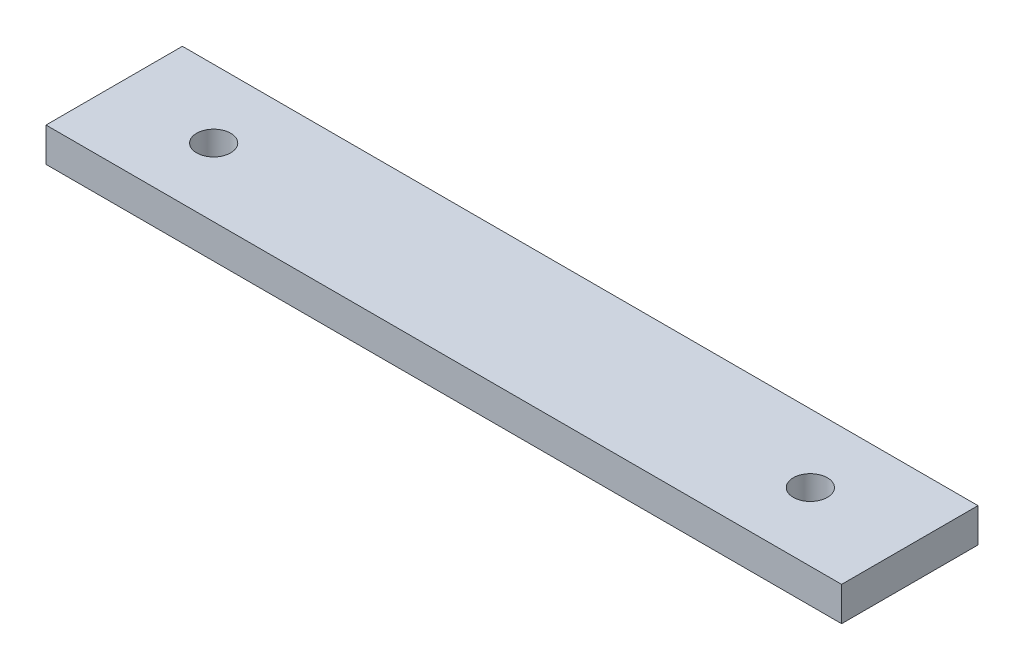
ISO-10303-21;
HEADER;
FILE_DESCRIPTION(('STEP AP214'),'2;1');
FILE_NAME('part.step','',(''),(''),'','','');
FILE_SCHEMA(('AUTOMOTIVE_DESIGN { 1 0 10303 214 1 1 1 1 }'));
ENDSEC;
DATA;
#1=APPLICATION_CONTEXT('core data for automotive mechanical design processes');
#2=APPLICATION_PROTOCOL_DEFINITION('international standard','automotive_design',2000,#1);
#3=PRODUCT_CONTEXT('',#1,'mechanical');
#4=PRODUCT('Part','Part','',(#3));
#5=PRODUCT_RELATED_PRODUCT_CATEGORY('part','',(#4));
#6=PRODUCT_DEFINITION_FORMATION('','',#4);
#7=PRODUCT_DEFINITION_CONTEXT('part definition',#1,'design');
#8=PRODUCT_DEFINITION('design','',#6,#7);
#9=PRODUCT_DEFINITION_SHAPE('','',#8);
#10=(LENGTH_UNIT() NAMED_UNIT(*) SI_UNIT(.MILLI.,.METRE.));
#11=(NAMED_UNIT(*) PLANE_ANGLE_UNIT() SI_UNIT($,.RADIAN.));
#12=(NAMED_UNIT(*) SI_UNIT($,.STERADIAN.) SOLID_ANGLE_UNIT());
#13=UNCERTAINTY_MEASURE_WITH_UNIT(LENGTH_MEASURE(1.E-05),#10,'distance_accuracy_value','');
#14=(GEOMETRIC_REPRESENTATION_CONTEXT(3) GLOBAL_UNCERTAINTY_ASSIGNED_CONTEXT((#13)) GLOBAL_UNIT_ASSIGNED_CONTEXT((#10,
#11,#12)) REPRESENTATION_CONTEXT('',''));
#15=CARTESIAN_POINT('',(0.,0.,0.));
#16=DIRECTION('',(0.,0.,1.));
#17=DIRECTION('',(1.,0.,0.));
#18=AXIS2_PLACEMENT_3D('',#15,#16,#17);
#19=CARTESIAN_POINT('',(35.,3.,6.));
#20=DIRECTION('',(-1.,0.,0.));
#21=DIRECTION('',(0.,0.,1.));
#22=AXIS2_PLACEMENT_3D('',#19,#20,#21);
#23=PLANE('',#22);
#24=DIRECTION('',(0.,0.,-1.));
#25=VECTOR('',#24,1.);
#26=CARTESIAN_POINT('',(35.,0.,6.));
#27=LINE('',#26,#25);
#28=CARTESIAN_POINT('',(35.,0.,6.));
#29=VERTEX_POINT('',#28);
#30=CARTESIAN_POINT('',(35.,0.,-6.));
#31=VERTEX_POINT('',#30);
#32=EDGE_CURVE('E105',#29,#31,#27,.T.);
#33=ORIENTED_EDGE('',*,*,#32,.T.);
#34=DIRECTION('',(0.,-1.,0.));
#35=VECTOR('',#34,1.);
#36=CARTESIAN_POINT('',(35.,3.,-6.));
#37=LINE('',#36,#35);
#38=CARTESIAN_POINT('',(35.,3.,-6.));
#39=VERTEX_POINT('',#38);
#40=EDGE_CURVE('E11',#39,#31,#37,.T.);
#41=ORIENTED_EDGE('',*,*,#40,.F.);
#42=DIRECTION('',(0.,0.,-1.));
#43=VECTOR('',#42,1.);
#44=CARTESIAN_POINT('',(35.,3.,6.));
#45=LINE('',#44,#43);
#46=CARTESIAN_POINT('',(35.,3.,6.));
#47=VERTEX_POINT('',#46);
#48=EDGE_CURVE('E89',#47,#39,#45,.T.);
#49=ORIENTED_EDGE('',*,*,#48,.F.);
#50=DIRECTION('',(0.,-1.,0.));
#51=VECTOR('',#50,1.);
#52=CARTESIAN_POINT('',(35.,3.,6.));
#53=LINE('',#52,#51);
#54=EDGE_CURVE('E98',#47,#29,#53,.T.);
#55=ORIENTED_EDGE('',*,*,#54,.T.);
#56=EDGE_LOOP('',(#33,#41,#49,#55));
#57=FACE_BOUND('',#56,.T.);
#58=ADVANCED_FACE('F39',(#57),#23,.F.);
#59=CARTESIAN_POINT('',(-35.,3.,-6.));
#60=DIRECTION('',(0.,0.,1.));
#61=DIRECTION('',(1.,0.,0.));
#62=AXIS2_PLACEMENT_3D('',#59,#60,#61);
#63=PLANE('',#62);
#64=DIRECTION('',(-1.,0.,0.));
#65=VECTOR('',#64,1.);
#66=CARTESIAN_POINT('',(-35.,0.,-6.));
#67=LINE('',#66,#65);
#68=CARTESIAN_POINT('',(-35.,0.,-6.));
#69=VERTEX_POINT('',#68);
#70=EDGE_CURVE('E94',#31,#69,#67,.T.);
#71=ORIENTED_EDGE('',*,*,#70,.T.);
#72=DIRECTION('',(0.,-1.,0.));
#73=VECTOR('',#72,1.);
#74=CARTESIAN_POINT('',(-35.,3.,-6.));
#75=LINE('',#74,#73);
#76=CARTESIAN_POINT('',(-35.,3.,-6.));
#77=VERTEX_POINT('',#76);
#78=EDGE_CURVE('E50',#77,#69,#75,.T.);
#79=ORIENTED_EDGE('',*,*,#78,.F.);
#80=DIRECTION('',(-1.,0.,0.));
#81=VECTOR('',#80,1.);
#82=CARTESIAN_POINT('',(-35.,3.,-6.));
#83=LINE('',#82,#81);
#84=EDGE_CURVE('E84',#39,#77,#83,.T.);
#85=ORIENTED_EDGE('',*,*,#84,.F.);
#86=ORIENTED_EDGE('',*,*,#40,.T.);
#87=EDGE_LOOP('',(#71,#79,#85,#86));
#88=FACE_BOUND('',#87,.T.);
#89=ADVANCED_FACE('F91',(#88),#63,.F.);
#90=CARTESIAN_POINT('',(-35.,3.,6.));
#91=DIRECTION('',(1.,0.,0.));
#92=DIRECTION('',(0.,0.,-1.));
#93=AXIS2_PLACEMENT_3D('',#90,#91,#92);
#94=PLANE('',#93);
#95=DIRECTION('',(0.,0.,1.));
#96=VECTOR('',#95,1.);
#97=CARTESIAN_POINT('',(-35.,0.,6.));
#98=LINE('',#97,#96);
#99=CARTESIAN_POINT('',(-35.,0.,6.));
#100=VERTEX_POINT('',#99);
#101=EDGE_CURVE('E75',#69,#100,#98,.T.);
#102=ORIENTED_EDGE('',*,*,#101,.T.);
#103=DIRECTION('',(0.,-1.,0.));
#104=VECTOR('',#103,1.);
#105=CARTESIAN_POINT('',(-35.,3.,6.));
#106=LINE('',#105,#104);
#107=CARTESIAN_POINT('',(-35.,3.,6.));
#108=VERTEX_POINT('',#107);
#109=EDGE_CURVE('E92',#108,#100,#106,.T.);
#110=ORIENTED_EDGE('',*,*,#109,.F.);
#111=DIRECTION('',(0.,0.,1.));
#112=VECTOR('',#111,1.);
#113=CARTESIAN_POINT('',(-35.,3.,6.));
#114=LINE('',#113,#112);
#115=EDGE_CURVE('E86',#77,#108,#114,.T.);
#116=ORIENTED_EDGE('',*,*,#115,.F.);
#117=ORIENTED_EDGE('',*,*,#78,.T.);
#118=EDGE_LOOP('',(#102,#110,#116,#117));
#119=FACE_BOUND('',#118,.T.);
#120=ADVANCED_FACE('F96',(#119),#94,.F.);
#121=CARTESIAN_POINT('',(-35.,3.,6.));
#122=DIRECTION('',(0.,0.,-1.));
#123=DIRECTION('',(-1.,0.,0.));
#124=AXIS2_PLACEMENT_3D('',#121,#122,#123);
#125=PLANE('',#124);
#126=DIRECTION('',(1.,0.,0.));
#127=VECTOR('',#126,1.);
#128=CARTESIAN_POINT('',(-35.,0.,6.));
#129=LINE('',#128,#127);
#130=EDGE_CURVE('E76',#100,#29,#129,.T.);
#131=ORIENTED_EDGE('',*,*,#130,.T.);
#132=ORIENTED_EDGE('',*,*,#54,.F.);
#133=DIRECTION('',(1.,0.,0.));
#134=VECTOR('',#133,1.);
#135=CARTESIAN_POINT('',(-35.,3.,6.));
#136=LINE('',#135,#134);
#137=EDGE_CURVE('E54',#108,#47,#136,.T.);
#138=ORIENTED_EDGE('',*,*,#137,.F.);
#139=ORIENTED_EDGE('',*,*,#109,.T.);
#140=EDGE_LOOP('',(#131,#132,#138,#139));
#141=FACE_BOUND('',#140,.T.);
#142=ADVANCED_FACE('F109',(#141),#125,.F.);
#143=CARTESIAN_POINT('',(0.,3.,0.));
#144=DIRECTION('',(0.,-1.,0.));
#145=DIRECTION('',(0.,0.,-1.));
#146=AXIS2_PLACEMENT_3D('',#143,#144,#145);
#147=PLANE('',#146);
#148=CARTESIAN_POINT('',(26.25,3.,0.));
#149=DIRECTION('',(0.,1.,0.));
#150=DIRECTION('',(0.,0.,1.));
#151=AXIS2_PLACEMENT_3D('',#148,#149,#150);
#152=CIRCLE('',#151,1.5);
#153=CARTESIAN_POINT('',(26.25,3.,1.49999999999999));
#154=VERTEX_POINT('',#153);
#155=EDGE_CURVE('E125',#154,#154,#152,.T.);
#156=ORIENTED_EDGE('',*,*,#155,.F.);
#157=EDGE_LOOP('',(#156));
#158=FACE_BOUND('',#157,.T.);
#159=CARTESIAN_POINT('',(-26.25,3.,0.));
#160=DIRECTION('',(0.,1.,0.));
#161=DIRECTION('',(0.,0.,1.));
#162=AXIS2_PLACEMENT_3D('',#159,#160,#161);
#163=CIRCLE('',#162,1.5);
#164=CARTESIAN_POINT('',(-26.25,3.,1.5));
#165=VERTEX_POINT('',#164);
#166=EDGE_CURVE('E117',#165,#165,#163,.T.);
#167=ORIENTED_EDGE('',*,*,#166,.F.);
#168=EDGE_LOOP('',(#167));
#169=FACE_BOUND('',#168,.T.);
#170=ORIENTED_EDGE('',*,*,#48,.T.);
#171=ORIENTED_EDGE('',*,*,#84,.T.);
#172=ORIENTED_EDGE('',*,*,#115,.T.);
#173=ORIENTED_EDGE('',*,*,#137,.T.);
#174=EDGE_LOOP('',(#170,#171,#172,#173));
#175=FACE_BOUND('',#174,.T.);
#176=ADVANCED_FACE('F88',(#158,#169,#175),#147,.F.);
#177=CARTESIAN_POINT('',(0.,0.,0.));
#178=DIRECTION('',(0.,-1.,0.));
#179=DIRECTION('',(0.,0.,-1.));
#180=AXIS2_PLACEMENT_3D('',#177,#178,#179);
#181=PLANE('',#180);
#182=CARTESIAN_POINT('',(26.25,0.,0.));
#183=DIRECTION('',(0.,1.,0.));
#184=DIRECTION('',(0.,0.,1.));
#185=AXIS2_PLACEMENT_3D('',#182,#183,#184);
#186=CIRCLE('',#185,1.5);
#187=CARTESIAN_POINT('',(26.25,0.,1.49999999999999));
#188=VERTEX_POINT('',#187);
#189=EDGE_CURVE('E104',#188,#188,#186,.T.);
#190=ORIENTED_EDGE('',*,*,#189,.T.);
#191=EDGE_LOOP('',(#190));
#192=FACE_BOUND('',#191,.T.);
#193=CARTESIAN_POINT('',(-26.25,0.,0.));
#194=DIRECTION('',(0.,1.,0.));
#195=DIRECTION('',(0.,0.,1.));
#196=AXIS2_PLACEMENT_3D('',#193,#194,#195);
#197=CIRCLE('',#196,1.5);
#198=CARTESIAN_POINT('',(-26.25,0.,1.5));
#199=VERTEX_POINT('',#198);
#200=EDGE_CURVE('E118',#199,#199,#197,.T.);
#201=ORIENTED_EDGE('',*,*,#200,.T.);
#202=EDGE_LOOP('',(#201));
#203=FACE_BOUND('',#202,.T.);
#204=ORIENTED_EDGE('',*,*,#32,.F.);
#205=ORIENTED_EDGE('',*,*,#130,.F.);
#206=ORIENTED_EDGE('',*,*,#101,.F.);
#207=ORIENTED_EDGE('',*,*,#70,.F.);
#208=EDGE_LOOP('',(#204,#205,#206,#207));
#209=FACE_BOUND('',#208,.T.);
#210=ADVANCED_FACE('F114',(#192,#203,#209),#181,.T.);
#211=CARTESIAN_POINT('',(-26.25,0.,0.));
#212=DIRECTION('',(0.,1.,0.));
#213=DIRECTION('',(0.,0.,1.));
#214=AXIS2_PLACEMENT_3D('',#211,#212,#213);
#215=CYLINDRICAL_SURFACE('',#214,1.5);
#216=ORIENTED_EDGE('',*,*,#200,.F.);
#217=EDGE_LOOP('',(#216));
#218=FACE_BOUND('',#217,.T.);
#219=ORIENTED_EDGE('',*,*,#166,.T.);
#220=EDGE_LOOP('',(#219));
#221=FACE_BOUND('',#220,.T.);
#222=ADVANCED_FACE('F131',(#218,#221),#215,.F.);
#223=CARTESIAN_POINT('',(26.25,0.,0.));
#224=DIRECTION('',(0.,1.,0.));
#225=DIRECTION('',(0.,0.,1.));
#226=AXIS2_PLACEMENT_3D('',#223,#224,#225);
#227=CYLINDRICAL_SURFACE('',#226,1.5);
#228=ORIENTED_EDGE('',*,*,#189,.F.);
#229=EDGE_LOOP('',(#228));
#230=FACE_BOUND('',#229,.T.);
#231=ORIENTED_EDGE('',*,*,#155,.T.);
#232=EDGE_LOOP('',(#231));
#233=FACE_BOUND('',#232,.T.);
#234=ADVANCED_FACE('F128',(#230,#233),#227,.F.);
#235=CLOSED_SHELL('',(#58,#89,#120,#142,#176,#210,#222,#234));
#236=MANIFOLD_SOLID_BREP('B2',#235);
#237=ADVANCED_BREP_SHAPE_REPRESENTATION('',(#18,#236),#14);
#238=SHAPE_DEFINITION_REPRESENTATION(#9,#237);
ENDSEC;
END-ISO-10303-21;
